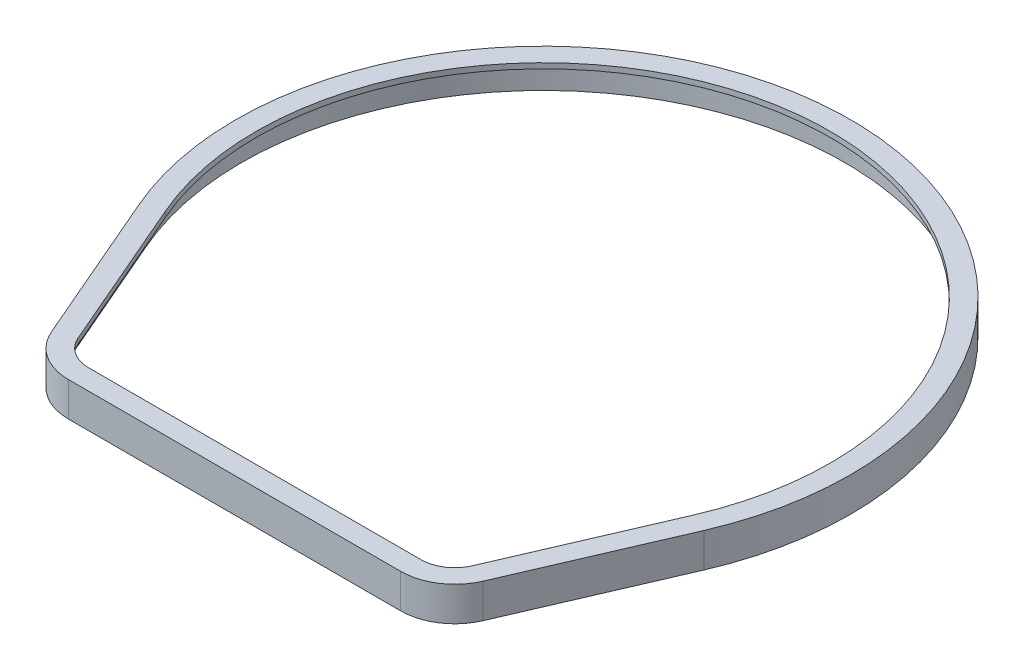
ISO-10303-21;
HEADER;
FILE_DESCRIPTION(('STEP AP214'),'2;1');
FILE_NAME('part.step','',(''),(''),'','','');
FILE_SCHEMA(('AUTOMOTIVE_DESIGN { 1 0 10303 214 1 1 1 1 }'));
ENDSEC;
DATA;
#1=APPLICATION_CONTEXT('core data for automotive mechanical design processes');
#2=APPLICATION_PROTOCOL_DEFINITION('international standard','automotive_design',2000,#1);
#3=PRODUCT_CONTEXT('',#1,'mechanical');
#4=PRODUCT('Part','Part','',(#3));
#5=PRODUCT_RELATED_PRODUCT_CATEGORY('part','',(#4));
#6=PRODUCT_DEFINITION_FORMATION('','',#4);
#7=PRODUCT_DEFINITION_CONTEXT('part definition',#1,'design');
#8=PRODUCT_DEFINITION('design','',#6,#7);
#9=PRODUCT_DEFINITION_SHAPE('','',#8);
#10=(LENGTH_UNIT() NAMED_UNIT(*) SI_UNIT(.MILLI.,.METRE.));
#11=(NAMED_UNIT(*) PLANE_ANGLE_UNIT() SI_UNIT($,.RADIAN.));
#12=(NAMED_UNIT(*) SI_UNIT($,.STERADIAN.) SOLID_ANGLE_UNIT());
#13=UNCERTAINTY_MEASURE_WITH_UNIT(LENGTH_MEASURE(1.E-05),#10,'distance_accuracy_value','');
#14=(GEOMETRIC_REPRESENTATION_CONTEXT(3) GLOBAL_UNCERTAINTY_ASSIGNED_CONTEXT((#13)) GLOBAL_UNIT_ASSIGNED_CONTEXT((#10,
#11,#12)) REPRESENTATION_CONTEXT('',''));
#15=CARTESIAN_POINT('',(0.,0.,0.));
#16=DIRECTION('',(0.,0.,1.));
#17=DIRECTION('',(1.,0.,0.));
#18=AXIS2_PLACEMENT_3D('',#15,#16,#17);
#19=CARTESIAN_POINT('',(58.4908938392196,6.,25.2290574118247));
#20=DIRECTION('',(-0.91822439308037,0.,-0.396060555915615));
#21=DIRECTION('',(-0.396060555915615,0.,0.91822439308037));
#22=AXIS2_PLACEMENT_3D('',#19,#20,#21);
#23=PLANE('',#22);
#24=DIRECTION('',(0.396060555915615,0.,-0.91822439308037));
#25=VECTOR('',#24,1.);
#26=CARTESIAN_POINT('',(58.4908938392196,0.,25.2290574118247));
#27=LINE('',#26,#25);
#28=CARTESIAN_POINT('',(44.7068598792863,0.,57.1858782262549));
#29=VERTEX_POINT('',#28);
#30=CARTESIAN_POINT('',(58.4908938392195,0.,25.2290574118249));
#31=VERTEX_POINT('',#30);
#32=EDGE_CURVE('E121',#29,#31,#27,.T.);
#33=ORIENTED_EDGE('',*,*,#32,.T.);
#34=DIRECTION('',(0.,-1.,0.));
#35=VECTOR('',#34,1.);
#36=CARTESIAN_POINT('',(58.4908938392195,6.,25.2290574118249));
#37=LINE('',#36,#35);
#38=CARTESIAN_POINT('',(58.4908938392195,7.1,25.2290574118249));
#39=VERTEX_POINT('',#38);
#40=EDGE_CURVE('E11',#39,#31,#37,.T.);
#41=ORIENTED_EDGE('',*,*,#40,.F.);
#42=DIRECTION('',(0.396060555915615,0.,-0.91822439308037));
#43=VECTOR('',#42,1.);
#44=CARTESIAN_POINT('',(44.7068598792863,7.1,57.1858782262549));
#45=LINE('',#44,#43);
#46=CARTESIAN_POINT('',(44.7068598792863,7.1,57.1858782262549));
#47=VERTEX_POINT('',#46);
#48=EDGE_CURVE('E211',#47,#39,#45,.T.);
#49=ORIENTED_EDGE('',*,*,#48,.F.);
#50=DIRECTION('',(0.,-1.,0.));
#51=VECTOR('',#50,1.);
#52=CARTESIAN_POINT('',(44.7068598792863,6.,57.1858782262549));
#53=LINE('',#52,#51);
#54=EDGE_CURVE('E116',#47,#29,#53,.T.);
#55=ORIENTED_EDGE('',*,*,#54,.T.);
#56=EDGE_LOOP('',(#33,#41,#49,#55));
#57=FACE_BOUND('',#56,.T.);
#58=ADVANCED_FACE('F34',(#57),#23,.F.);
#59=CARTESIAN_POINT('',(0.,6.,0.));
#60=DIRECTION('',(0.,-1.,0.));
#61=DIRECTION('',(0.,0.,-1.));
#62=AXIS2_PLACEMENT_3D('',#59,#60,#61);
#63=CYLINDRICAL_SURFACE('',#62,63.7);
#64=CARTESIAN_POINT('',(0.,0.,0.));
#65=DIRECTION('',(0.,1.,0.));
#66=DIRECTION('',(0.,0.,1.));
#67=AXIS2_PLACEMENT_3D('',#64,#65,#66);
#68=CIRCLE('',#67,63.7);
#69=CARTESIAN_POINT('',(-58.4908938392195,0.,25.2290574118249));
#70=VERTEX_POINT('',#69);
#71=EDGE_CURVE('E184',#31,#70,#68,.T.);
#72=ORIENTED_EDGE('',*,*,#71,.T.);
#73=DIRECTION('',(0.,-1.,0.));
#74=VECTOR('',#73,1.);
#75=CARTESIAN_POINT('',(-58.4908938392195,6.,25.2290574118249));
#76=LINE('',#75,#74);
#77=CARTESIAN_POINT('',(-58.4908938392195,7.1,25.2290574118249));
#78=VERTEX_POINT('',#77);
#79=EDGE_CURVE('E44',#78,#70,#76,.T.);
#80=ORIENTED_EDGE('',*,*,#79,.F.);
#81=CARTESIAN_POINT('',(0.,7.1,0.));
#82=DIRECTION('',(0.,1.,0.));
#83=DIRECTION('',(0.,0.,1.));
#84=AXIS2_PLACEMENT_3D('',#81,#82,#83);
#85=CIRCLE('',#84,63.7);
#86=EDGE_CURVE('E170',#39,#78,#85,.T.);
#87=ORIENTED_EDGE('',*,*,#86,.F.);
#88=ORIENTED_EDGE('',*,*,#40,.T.);
#89=EDGE_LOOP('',(#72,#80,#87,#88));
#90=FACE_BOUND('',#89,.T.);
#91=ADVANCED_FACE('F204',(#90),#63,.T.);
#92=CARTESIAN_POINT('',(-58.4908938392196,6.,25.2290574118247));
#93=DIRECTION('',(-0.91822439308037,0.,0.396060555915615));
#94=DIRECTION('',(0.396060555915615,0.,0.91822439308037));
#95=AXIS2_PLACEMENT_3D('',#92,#93,#94);
#96=PLANE('',#95);
#97=DIRECTION('',(-0.396060555915615,0.,-0.91822439308037));
#98=VECTOR('',#97,1.);
#99=CARTESIAN_POINT('',(-58.4908938392196,0.,25.2290574118247));
#100=LINE('',#99,#98);
#101=CARTESIAN_POINT('',(-44.7068598792863,0.,57.1858782262549));
#102=VERTEX_POINT('',#101);
#103=EDGE_CURVE('E187',#102,#70,#100,.T.);
#104=ORIENTED_EDGE('',*,*,#103,.F.);
#105=DIRECTION('',(0.,-1.,0.));
#106=VECTOR('',#105,1.);
#107=CARTESIAN_POINT('',(-44.7068598792863,6.,57.1858782262549));
#108=LINE('',#107,#106);
#109=CARTESIAN_POINT('',(-44.7068598792863,7.1,57.1858782262549));
#110=VERTEX_POINT('',#109);
#111=EDGE_CURVE('E131',#110,#102,#108,.T.);
#112=ORIENTED_EDGE('',*,*,#111,.F.);
#113=DIRECTION('',(0.396060555915615,0.,0.91822439308037));
#114=VECTOR('',#113,1.);
#115=CARTESIAN_POINT('',(-58.4908938392195,7.1,25.2290574118249));
#116=LINE('',#115,#114);
#117=EDGE_CURVE('E167',#78,#110,#116,.T.);
#118=ORIENTED_EDGE('',*,*,#117,.F.);
#119=ORIENTED_EDGE('',*,*,#79,.T.);
#120=EDGE_LOOP('',(#104,#112,#118,#119));
#121=FACE_BOUND('',#120,.T.);
#122=ADVANCED_FACE('F196',(#121),#96,.T.);
#123=CARTESIAN_POINT('',(-34.4227466767862,6.,52.75));
#124=DIRECTION('',(0.,-1.,0.));
#125=DIRECTION('',(0.,0.,-1.));
#126=AXIS2_PLACEMENT_3D('',#123,#124,#125);
#127=CYLINDRICAL_SURFACE('',#126,11.2);
#128=CARTESIAN_POINT('',(-34.4227466767862,0.,52.75));
#129=DIRECTION('',(0.,1.,0.));
#130=DIRECTION('',(0.,0.,1.));
#131=AXIS2_PLACEMENT_3D('',#128,#129,#130);
#132=CIRCLE('',#131,11.2);
#133=CARTESIAN_POINT('',(-34.4227466767862,0.,63.95));
#134=VERTEX_POINT('',#133);
#135=EDGE_CURVE('E107',#102,#134,#132,.T.);
#136=ORIENTED_EDGE('',*,*,#135,.T.);
#137=DIRECTION('',(0.,-1.,0.));
#138=VECTOR('',#137,1.);
#139=CARTESIAN_POINT('',(-34.4227466767862,6.,63.95));
#140=LINE('',#139,#138);
#141=CARTESIAN_POINT('',(-34.4227466767862,7.1,63.95));
#142=VERTEX_POINT('',#141);
#143=EDGE_CURVE('E102',#142,#134,#140,.T.);
#144=ORIENTED_EDGE('',*,*,#143,.F.);
#145=CARTESIAN_POINT('',(-34.4227466767862,7.1,52.75));
#146=DIRECTION('',(0.,1.,0.));
#147=DIRECTION('',(0.,0.,1.));
#148=AXIS2_PLACEMENT_3D('',#145,#146,#147);
#149=CIRCLE('',#148,11.2);
#150=EDGE_CURVE('E220',#110,#142,#149,.T.);
#151=ORIENTED_EDGE('',*,*,#150,.F.);
#152=ORIENTED_EDGE('',*,*,#111,.T.);
#153=EDGE_LOOP('',(#136,#144,#151,#152));
#154=FACE_BOUND('',#153,.T.);
#155=ADVANCED_FACE('F190',(#154),#127,.T.);
#156=CARTESIAN_POINT('',(0.,6.,63.95));
#157=DIRECTION('',(0.,0.,-1.));
#158=DIRECTION('',(-1.,0.,0.));
#159=AXIS2_PLACEMENT_3D('',#156,#157,#158);
#160=PLANE('',#159);
#161=DIRECTION('',(1.,0.,0.));
#162=VECTOR('',#161,1.);
#163=CARTESIAN_POINT('',(0.,0.,63.95));
#164=LINE('',#163,#162);
#165=CARTESIAN_POINT('',(34.4227466767862,0.,63.95));
#166=VERTEX_POINT('',#165);
#167=EDGE_CURVE('E94',#134,#166,#164,.T.);
#168=ORIENTED_EDGE('',*,*,#167,.T.);
#169=DIRECTION('',(0.,-1.,0.));
#170=VECTOR('',#169,1.);
#171=CARTESIAN_POINT('',(34.4227466767862,6.,63.95));
#172=LINE('',#171,#170);
#173=CARTESIAN_POINT('',(34.4227466767862,7.1,63.95));
#174=VERTEX_POINT('',#173);
#175=EDGE_CURVE('E99',#174,#166,#172,.T.);
#176=ORIENTED_EDGE('',*,*,#175,.F.);
#177=DIRECTION('',(1.,0.,0.));
#178=VECTOR('',#177,1.);
#179=CARTESIAN_POINT('',(-34.4227466767862,7.1,63.95));
#180=LINE('',#179,#178);
#181=EDGE_CURVE('E217',#142,#174,#180,.T.);
#182=ORIENTED_EDGE('',*,*,#181,.F.);
#183=ORIENTED_EDGE('',*,*,#143,.T.);
#184=EDGE_LOOP('',(#168,#176,#182,#183));
#185=FACE_BOUND('',#184,.T.);
#186=ADVANCED_FACE('F96',(#185),#160,.F.);
#187=CARTESIAN_POINT('',(-34.4227466767862,6.,52.75));
#188=DIRECTION('',(0.,-1.,0.));
#189=DIRECTION('',(0.,0.,-1.));
#190=AXIS2_PLACEMENT_3D('',#187,#188,#189);
#191=CYLINDRICAL_SURFACE('',#190,10.);
#192=CARTESIAN_POINT('',(-34.4227466767862,0.,52.75));
#193=DIRECTION('',(0.,1.,0.));
#194=DIRECTION('',(0.,0.,1.));
#195=AXIS2_PLACEMENT_3D('',#192,#193,#194);
#196=CIRCLE('',#195,10.);
#197=CARTESIAN_POINT('',(-43.6049906075899,0.,56.7106055591561));
#198=VERTEX_POINT('',#197);
#199=CARTESIAN_POINT('',(-34.4227466767862,0.,62.75));
#200=VERTEX_POINT('',#199);
#201=EDGE_CURVE('E161',#198,#200,#196,.T.);
#202=ORIENTED_EDGE('',*,*,#201,.F.);
#203=DIRECTION('',(0.,-1.,0.));
#204=VECTOR('',#203,1.);
#205=CARTESIAN_POINT('',(-43.6049906075899,6.,56.7106055591561));
#206=LINE('',#205,#204);
#207=CARTESIAN_POINT('',(-43.6049906075899,6.,56.7106055591561));
#208=VERTEX_POINT('',#207);
#209=EDGE_CURVE('E38',#208,#198,#206,.T.);
#210=ORIENTED_EDGE('',*,*,#209,.F.);
#211=CARTESIAN_POINT('',(-34.4227466767862,6.,52.75));
#212=DIRECTION('',(0.,1.,0.));
#213=DIRECTION('',(0.,0.,1.));
#214=AXIS2_PLACEMENT_3D('',#211,#212,#213);
#215=CIRCLE('',#214,10.);
#216=CARTESIAN_POINT('',(-34.4227466767862,6.,62.75));
#217=VERTEX_POINT('',#216);
#218=EDGE_CURVE('E122',#208,#217,#215,.T.);
#219=ORIENTED_EDGE('',*,*,#218,.T.);
#220=DIRECTION('',(0.,-1.,0.));
#221=VECTOR('',#220,1.);
#222=CARTESIAN_POINT('',(-34.4227466767862,6.,62.75));
#223=LINE('',#222,#221);
#224=EDGE_CURVE('E134',#217,#200,#223,.T.);
#225=ORIENTED_EDGE('',*,*,#224,.T.);
#226=EDGE_LOOP('',(#202,#210,#219,#225));
#227=FACE_BOUND('',#226,.T.);
#228=ADVANCED_FACE('F36',(#227),#191,.F.);
#229=CARTESIAN_POINT('',(-57.3890245675231,6.,24.7537847447259));
#230=DIRECTION('',(-0.91822439308037,0.,0.396060555915615));
#231=DIRECTION('',(0.396060555915615,0.,0.91822439308037));
#232=AXIS2_PLACEMENT_3D('',#229,#230,#231);
#233=PLANE('',#232);
#234=DIRECTION('',(-0.396060555915615,0.,-0.91822439308037));
#235=VECTOR('',#234,1.);
#236=CARTESIAN_POINT('',(-57.3890245675231,0.,24.7537847447259));
#237=LINE('',#236,#235);
#238=CARTESIAN_POINT('',(-57.3890245675231,0.,24.7537847447261));
#239=VERTEX_POINT('',#238);
#240=EDGE_CURVE('E153',#198,#239,#237,.T.);
#241=ORIENTED_EDGE('',*,*,#240,.T.);
#242=DIRECTION('',(0.,-1.,0.));
#243=VECTOR('',#242,1.);
#244=CARTESIAN_POINT('',(-57.3890245675231,6.,24.7537847447261));
#245=LINE('',#244,#243);
#246=CARTESIAN_POINT('',(-57.3890245675231,6.,24.7537847447261));
#247=VERTEX_POINT('',#246);
#248=EDGE_CURVE('E142',#247,#239,#245,.T.);
#249=ORIENTED_EDGE('',*,*,#248,.F.);
#250=DIRECTION('',(-0.396060555915615,0.,-0.91822439308037));
#251=VECTOR('',#250,1.);
#252=CARTESIAN_POINT('',(-57.3890245675231,6.,24.7537847447259));
#253=LINE('',#252,#251);
#254=EDGE_CURVE('E125',#208,#247,#253,.T.);
#255=ORIENTED_EDGE('',*,*,#254,.F.);
#256=ORIENTED_EDGE('',*,*,#209,.T.);
#257=EDGE_LOOP('',(#241,#249,#255,#256));
#258=FACE_BOUND('',#257,.T.);
#259=ADVANCED_FACE('F152',(#258),#233,.F.);
#260=CARTESIAN_POINT('',(0.,6.,0.));
#261=DIRECTION('',(0.,-1.,0.));
#262=DIRECTION('',(0.,0.,-1.));
#263=AXIS2_PLACEMENT_3D('',#260,#261,#262);
#264=CYLINDRICAL_SURFACE('',#263,62.5);
#265=CARTESIAN_POINT('',(0.,0.,0.));
#266=DIRECTION('',(0.,1.,0.));
#267=DIRECTION('',(0.,0.,1.));
#268=AXIS2_PLACEMENT_3D('',#265,#266,#267);
#269=CIRCLE('',#268,62.5);
#270=CARTESIAN_POINT('',(57.3890245675231,0.,24.7537847447261));
#271=VERTEX_POINT('',#270);
#272=EDGE_CURVE('E164',#271,#239,#269,.T.);
#273=ORIENTED_EDGE('',*,*,#272,.F.);
#274=DIRECTION('',(0.,-1.,0.));
#275=VECTOR('',#274,1.);
#276=CARTESIAN_POINT('',(57.3890245675231,6.,24.7537847447261));
#277=LINE('',#276,#275);
#278=CARTESIAN_POINT('',(57.3890245675231,6.,24.7537847447261));
#279=VERTEX_POINT('',#278);
#280=EDGE_CURVE('E141',#279,#271,#277,.T.);
#281=ORIENTED_EDGE('',*,*,#280,.F.);
#282=CARTESIAN_POINT('',(0.,6.,0.));
#283=DIRECTION('',(0.,1.,0.));
#284=DIRECTION('',(0.,0.,1.));
#285=AXIS2_PLACEMENT_3D('',#282,#283,#284);
#286=CIRCLE('',#285,62.5);
#287=EDGE_CURVE('E226',#279,#247,#286,.T.);
#288=ORIENTED_EDGE('',*,*,#287,.T.);
#289=ORIENTED_EDGE('',*,*,#248,.T.);
#290=EDGE_LOOP('',(#273,#281,#288,#289));
#291=FACE_BOUND('',#290,.T.);
#292=ADVANCED_FACE('F251',(#291),#264,.F.);
#293=CARTESIAN_POINT('',(57.3890245675231,6.,24.7537847447259));
#294=DIRECTION('',(-0.91822439308037,0.,-0.396060555915615));
#295=DIRECTION('',(-0.396060555915615,0.,0.91822439308037));
#296=AXIS2_PLACEMENT_3D('',#293,#294,#295);
#297=PLANE('',#296);
#298=DIRECTION('',(0.396060555915615,0.,-0.91822439308037));
#299=VECTOR('',#298,1.);
#300=CARTESIAN_POINT('',(57.3890245675231,0.,24.7537847447259));
#301=LINE('',#300,#299);
#302=CARTESIAN_POINT('',(43.6049906075899,0.,56.7106055591561));
#303=VERTEX_POINT('',#302);
#304=EDGE_CURVE('E176',#303,#271,#301,.T.);
#305=ORIENTED_EDGE('',*,*,#304,.F.);
#306=DIRECTION('',(0.,-1.,0.));
#307=VECTOR('',#306,1.);
#308=CARTESIAN_POINT('',(43.6049906075899,6.,56.7106055591561));
#309=LINE('',#308,#307);
#310=CARTESIAN_POINT('',(43.6049906075899,6.,56.7106055591561));
#311=VERTEX_POINT('',#310);
#312=EDGE_CURVE('E139',#311,#303,#309,.T.);
#313=ORIENTED_EDGE('',*,*,#312,.F.);
#314=DIRECTION('',(0.396060555915615,0.,-0.91822439308037));
#315=VECTOR('',#314,1.);
#316=CARTESIAN_POINT('',(57.3890245675231,6.,24.7537847447259));
#317=LINE('',#316,#315);
#318=EDGE_CURVE('E228',#311,#279,#317,.T.);
#319=ORIENTED_EDGE('',*,*,#318,.T.);
#320=ORIENTED_EDGE('',*,*,#280,.T.);
#321=EDGE_LOOP('',(#305,#313,#319,#320));
#322=FACE_BOUND('',#321,.T.);
#323=ADVANCED_FACE('F255',(#322),#297,.T.);
#324=CARTESIAN_POINT('',(34.4227466767862,6.,52.75));
#325=DIRECTION('',(0.,-1.,0.));
#326=DIRECTION('',(0.,0.,-1.));
#327=AXIS2_PLACEMENT_3D('',#324,#325,#326);
#328=CYLINDRICAL_SURFACE('',#327,10.);
#329=CARTESIAN_POINT('',(34.4227466767862,0.,52.75));
#330=DIRECTION('',(0.,1.,0.));
#331=DIRECTION('',(0.,0.,1.));
#332=AXIS2_PLACEMENT_3D('',#329,#330,#331);
#333=CIRCLE('',#332,10.);
#334=CARTESIAN_POINT('',(34.4227466767862,0.,62.75));
#335=VERTEX_POINT('',#334);
#336=EDGE_CURVE('E178',#335,#303,#333,.T.);
#337=ORIENTED_EDGE('',*,*,#336,.F.);
#338=DIRECTION('',(0.,-1.,0.));
#339=VECTOR('',#338,1.);
#340=CARTESIAN_POINT('',(34.4227466767862,6.,62.75));
#341=LINE('',#340,#339);
#342=CARTESIAN_POINT('',(34.4227466767862,6.,62.75));
#343=VERTEX_POINT('',#342);
#344=EDGE_CURVE('E136',#343,#335,#341,.T.);
#345=ORIENTED_EDGE('',*,*,#344,.F.);
#346=CARTESIAN_POINT('',(34.4227466767862,6.,52.75));
#347=DIRECTION('',(0.,1.,0.));
#348=DIRECTION('',(0.,0.,1.));
#349=AXIS2_PLACEMENT_3D('',#346,#347,#348);
#350=CIRCLE('',#349,10.);
#351=EDGE_CURVE('E52',#343,#311,#350,.T.);
#352=ORIENTED_EDGE('',*,*,#351,.T.);
#353=ORIENTED_EDGE('',*,*,#312,.T.);
#354=EDGE_LOOP('',(#337,#345,#352,#353));
#355=FACE_BOUND('',#354,.T.);
#356=ADVANCED_FACE('F256',(#355),#328,.F.);
#357=CARTESIAN_POINT('',(0.,6.,62.75));
#358=DIRECTION('',(0.,0.,-1.));
#359=DIRECTION('',(-1.,0.,0.));
#360=AXIS2_PLACEMENT_3D('',#357,#358,#359);
#361=PLANE('',#360);
#362=DIRECTION('',(1.,0.,0.));
#363=VECTOR('',#362,1.);
#364=CARTESIAN_POINT('',(0.,0.,62.75));
#365=LINE('',#364,#363);
#366=EDGE_CURVE('E181',#200,#335,#365,.T.);
#367=ORIENTED_EDGE('',*,*,#366,.F.);
#368=ORIENTED_EDGE('',*,*,#224,.F.);
#369=DIRECTION('',(1.,0.,0.));
#370=VECTOR('',#369,1.);
#371=CARTESIAN_POINT('',(0.,6.,62.75));
#372=LINE('',#371,#370);
#373=EDGE_CURVE('E137',#217,#343,#372,.T.);
#374=ORIENTED_EDGE('',*,*,#373,.T.);
#375=ORIENTED_EDGE('',*,*,#344,.T.);
#376=EDGE_LOOP('',(#367,#368,#374,#375));
#377=FACE_BOUND('',#376,.T.);
#378=ADVANCED_FACE('F234',(#377),#361,.T.);
#379=CARTESIAN_POINT('',(34.4227466767862,6.,52.75));
#380=DIRECTION('',(0.,-1.,0.));
#381=DIRECTION('',(0.,0.,-1.));
#382=AXIS2_PLACEMENT_3D('',#379,#380,#381);
#383=CYLINDRICAL_SURFACE('',#382,11.2);
#384=CARTESIAN_POINT('',(34.4227466767862,0.,52.75));
#385=DIRECTION('',(0.,1.,0.));
#386=DIRECTION('',(0.,0.,1.));
#387=AXIS2_PLACEMENT_3D('',#384,#385,#386);
#388=CIRCLE('',#387,11.2);
#389=EDGE_CURVE('E106',#166,#29,#388,.T.);
#390=ORIENTED_EDGE('',*,*,#389,.T.);
#391=ORIENTED_EDGE('',*,*,#54,.F.);
#392=CARTESIAN_POINT('',(34.4227466767862,7.1,52.75));
#393=DIRECTION('',(0.,1.,0.));
#394=DIRECTION('',(0.,0.,1.));
#395=AXIS2_PLACEMENT_3D('',#392,#393,#394);
#396=CIRCLE('',#395,11.2);
#397=EDGE_CURVE('E115',#174,#47,#396,.T.);
#398=ORIENTED_EDGE('',*,*,#397,.F.);
#399=ORIENTED_EDGE('',*,*,#175,.T.);
#400=EDGE_LOOP('',(#390,#391,#398,#399));
#401=FACE_BOUND('',#400,.T.);
#402=ADVANCED_FACE('F111',(#401),#383,.T.);
#403=CARTESIAN_POINT('',(0.,0.,0.));
#404=DIRECTION('',(0.,1.,0.));
#405=DIRECTION('',(0.,0.,1.));
#406=AXIS2_PLACEMENT_3D('',#403,#404,#405);
#407=PLANE('',#406);
#408=ORIENTED_EDGE('',*,*,#201,.T.);
#409=ORIENTED_EDGE('',*,*,#366,.T.);
#410=ORIENTED_EDGE('',*,*,#336,.T.);
#411=ORIENTED_EDGE('',*,*,#304,.T.);
#412=ORIENTED_EDGE('',*,*,#272,.T.);
#413=ORIENTED_EDGE('',*,*,#240,.F.);
#414=EDGE_LOOP('',(#408,#409,#410,#411,#412,#413));
#415=FACE_BOUND('',#414,.T.);
#416=ORIENTED_EDGE('',*,*,#32,.F.);
#417=ORIENTED_EDGE('',*,*,#389,.F.);
#418=ORIENTED_EDGE('',*,*,#167,.F.);
#419=ORIENTED_EDGE('',*,*,#135,.F.);
#420=ORIENTED_EDGE('',*,*,#103,.T.);
#421=ORIENTED_EDGE('',*,*,#71,.F.);
#422=EDGE_LOOP('',(#416,#417,#418,#419,#420,#421));
#423=FACE_BOUND('',#422,.T.);
#424=ADVANCED_FACE('F119',(#415,#423),#407,.F.);
#425=CARTESIAN_POINT('',(-34.4227466767862,6.,52.75));
#426=DIRECTION('',(0.,1.,0.));
#427=DIRECTION('',(0.,0.,1.));
#428=AXIS2_PLACEMENT_3D('',#425,#426,#427);
#429=PLANE('',#428);
#430=CARTESIAN_POINT('',(34.4227466767862,6.,52.75));
#431=DIRECTION('',(0.,1.,0.));
#432=DIRECTION('',(0.,0.,1.));
#433=AXIS2_PLACEMENT_3D('',#430,#431,#432);
#434=CIRCLE('',#433,7.00000000000001);
#435=CARTESIAN_POINT('',(34.4227466767862,6.,59.75));
#436=VERTEX_POINT('',#435);
#437=CARTESIAN_POINT('',(40.8503174283488,6.,55.5224238914093));
#438=VERTEX_POINT('',#437);
#439=EDGE_CURVE('E403',#436,#438,#434,.T.);
#440=ORIENTED_EDGE('',*,*,#439,.T.);
#441=DIRECTION('',(0.396060555915615,0.,-0.91822439308037));
#442=VECTOR('',#441,1.);
#443=CARTESIAN_POINT('',(40.8503174283488,6.,55.5224238914093));
#444=LINE('',#443,#442);
#445=CARTESIAN_POINT('',(54.6343513882819,6.,23.5656030769793));
#446=VERTEX_POINT('',#445);
#447=EDGE_CURVE('E391',#438,#446,#444,.T.);
#448=ORIENTED_EDGE('',*,*,#447,.T.);
#449=CARTESIAN_POINT('',(0.,6.,0.));
#450=DIRECTION('',(0.,1.,0.));
#451=DIRECTION('',(0.,0.,1.));
#452=AXIS2_PLACEMENT_3D('',#449,#450,#451);
#453=CIRCLE('',#452,59.5);
#454=CARTESIAN_POINT('',(-54.6343513882819,6.,23.5656030769793));
#455=VERTEX_POINT('',#454);
#456=EDGE_CURVE('E338',#446,#455,#453,.T.);
#457=ORIENTED_EDGE('',*,*,#456,.T.);
#458=DIRECTION('',(0.396060555915615,0.,0.91822439308037));
#459=VECTOR('',#458,1.);
#460=CARTESIAN_POINT('',(-54.6343513882819,6.,23.5656030769793));
#461=LINE('',#460,#459);
#462=CARTESIAN_POINT('',(-40.8503174283488,6.,55.5224238914093));
#463=VERTEX_POINT('',#462);
#464=EDGE_CURVE('E335',#455,#463,#461,.T.);
#465=ORIENTED_EDGE('',*,*,#464,.T.);
#466=CARTESIAN_POINT('',(-34.4227466767862,6.,52.75));
#467=DIRECTION('',(0.,1.,0.));
#468=DIRECTION('',(0.,0.,1.));
#469=AXIS2_PLACEMENT_3D('',#466,#467,#468);
#470=CIRCLE('',#469,7.00000000000001);
#471=CARTESIAN_POINT('',(-34.4227466767862,6.,59.75));
#472=VERTEX_POINT('',#471);
#473=EDGE_CURVE('E329',#463,#472,#470,.T.);
#474=ORIENTED_EDGE('',*,*,#473,.T.);
#475=DIRECTION('',(1.,0.,0.));
#476=VECTOR('',#475,1.);
#477=CARTESIAN_POINT('',(-34.4227466767862,6.,59.75));
#478=LINE('',#477,#476);
#479=EDGE_CURVE('E316',#472,#436,#478,.T.);
#480=ORIENTED_EDGE('',*,*,#479,.T.);
#481=EDGE_LOOP('',(#440,#448,#457,#465,#474,#480));
#482=FACE_BOUND('',#481,.T.);
#483=ORIENTED_EDGE('',*,*,#218,.F.);
#484=ORIENTED_EDGE('',*,*,#254,.T.);
#485=ORIENTED_EDGE('',*,*,#287,.F.);
#486=ORIENTED_EDGE('',*,*,#318,.F.);
#487=ORIENTED_EDGE('',*,*,#351,.F.);
#488=ORIENTED_EDGE('',*,*,#373,.F.);
#489=EDGE_LOOP('',(#483,#484,#485,#486,#487,#488));
#490=FACE_BOUND('',#489,.T.);
#491=ADVANCED_FACE('F238',(#482,#490),#429,.F.);
#492=CARTESIAN_POINT('',(-34.4227466767862,7.1,52.75));
#493=DIRECTION('',(0.,1.,0.));
#494=DIRECTION('',(0.,0.,1.));
#495=AXIS2_PLACEMENT_3D('',#492,#493,#494);
#496=PLANE('',#495);
#497=ORIENTED_EDGE('',*,*,#150,.T.);
#498=ORIENTED_EDGE('',*,*,#181,.T.);
#499=ORIENTED_EDGE('',*,*,#397,.T.);
#500=ORIENTED_EDGE('',*,*,#48,.T.);
#501=ORIENTED_EDGE('',*,*,#86,.T.);
#502=ORIENTED_EDGE('',*,*,#117,.T.);
#503=EDGE_LOOP('',(#497,#498,#499,#500,#501,#502));
#504=FACE_BOUND('',#503,.T.);
#505=DIRECTION('',(0.396060555915615,0.,-0.91822439308037));
#506=VECTOR('',#505,1.);
#507=CARTESIAN_POINT('',(40.8503174283488,7.1,55.5224238914093));
#508=LINE('',#507,#506);
#509=CARTESIAN_POINT('',(40.8503174283488,7.1,55.5224238914093));
#510=VERTEX_POINT('',#509);
#511=CARTESIAN_POINT('',(54.6343513882819,7.1,23.5656030769793));
#512=VERTEX_POINT('',#511);
#513=EDGE_CURVE('E387',#510,#512,#508,.T.);
#514=ORIENTED_EDGE('',*,*,#513,.F.);
#515=CARTESIAN_POINT('',(34.4227466767862,7.1,52.75));
#516=DIRECTION('',(0.,1.,0.));
#517=DIRECTION('',(0.,0.,1.));
#518=AXIS2_PLACEMENT_3D('',#515,#516,#517);
#519=CIRCLE('',#518,7.00000000000001);
#520=CARTESIAN_POINT('',(34.4227466767862,7.1,59.75));
#521=VERTEX_POINT('',#520);
#522=EDGE_CURVE('E328',#521,#510,#519,.T.);
#523=ORIENTED_EDGE('',*,*,#522,.F.);
#524=DIRECTION('',(1.,0.,0.));
#525=VECTOR('',#524,1.);
#526=CARTESIAN_POINT('',(-34.4227466767862,7.1,59.75));
#527=LINE('',#526,#525);
#528=CARTESIAN_POINT('',(-34.4227466767862,7.1,59.75));
#529=VERTEX_POINT('',#528);
#530=EDGE_CURVE('E343',#529,#521,#527,.T.);
#531=ORIENTED_EDGE('',*,*,#530,.F.);
#532=CARTESIAN_POINT('',(-34.4227466767862,7.1,52.75));
#533=DIRECTION('',(0.,1.,0.));
#534=DIRECTION('',(0.,0.,1.));
#535=AXIS2_PLACEMENT_3D('',#532,#533,#534);
#536=CIRCLE('',#535,7.00000000000001);
#537=CARTESIAN_POINT('',(-40.8503174283488,7.1,55.5224238914093));
#538=VERTEX_POINT('',#537);
#539=EDGE_CURVE('E400',#538,#529,#536,.T.);
#540=ORIENTED_EDGE('',*,*,#539,.F.);
#541=DIRECTION('',(0.396060555915615,0.,0.91822439308037));
#542=VECTOR('',#541,1.);
#543=CARTESIAN_POINT('',(-54.6343513882819,7.1,23.5656030769793));
#544=LINE('',#543,#542);
#545=CARTESIAN_POINT('',(-54.6343513882819,7.1,23.5656030769793));
#546=VERTEX_POINT('',#545);
#547=EDGE_CURVE('E396',#546,#538,#544,.T.);
#548=ORIENTED_EDGE('',*,*,#547,.F.);
#549=CARTESIAN_POINT('',(0.,7.1,0.));
#550=DIRECTION('',(0.,1.,0.));
#551=DIRECTION('',(0.,0.,1.));
#552=AXIS2_PLACEMENT_3D('',#549,#550,#551);
#553=CIRCLE('',#552,59.5);
#554=EDGE_CURVE('E394',#512,#546,#553,.T.);
#555=ORIENTED_EDGE('',*,*,#554,.F.);
#556=EDGE_LOOP('',(#514,#523,#531,#540,#548,#555));
#557=FACE_BOUND('',#556,.T.);
#558=ADVANCED_FACE('F215',(#504,#557),#496,.T.);
#559=CARTESIAN_POINT('',(34.4227466767862,7.1,52.75));
#560=DIRECTION('',(0.,-1.,0.));
#561=DIRECTION('',(0.,0.,-1.));
#562=AXIS2_PLACEMENT_3D('',#559,#560,#561);
#563=CYLINDRICAL_SURFACE('',#562,7.00000000000001);
#564=ORIENTED_EDGE('',*,*,#439,.F.);
#565=DIRECTION('',(0.,-1.,0.));
#566=VECTOR('',#565,1.);
#567=CARTESIAN_POINT('',(34.4227466767862,7.1,59.75));
#568=LINE('',#567,#566);
#569=EDGE_CURVE('E323',#521,#436,#568,.T.);
#570=ORIENTED_EDGE('',*,*,#569,.F.);
#571=ORIENTED_EDGE('',*,*,#522,.T.);
#572=DIRECTION('',(0.,-1.,0.));
#573=VECTOR('',#572,1.);
#574=CARTESIAN_POINT('',(40.8503174283488,7.1,55.5224238914093));
#575=LINE('',#574,#573);
#576=EDGE_CURVE('E354',#510,#438,#575,.T.);
#577=ORIENTED_EDGE('',*,*,#576,.T.);
#578=EDGE_LOOP('',(#564,#570,#571,#577));
#579=FACE_BOUND('',#578,.T.);
#580=ADVANCED_FACE('F287',(#579),#563,.F.);
#581=CARTESIAN_POINT('',(40.8503174283488,7.1,55.5224238914093));
#582=DIRECTION('',(-0.91822439308037,0.,-0.396060555915615));
#583=DIRECTION('',(-0.396060555915615,0.,0.91822439308037));
#584=AXIS2_PLACEMENT_3D('',#581,#582,#583);
#585=PLANE('',#584);
#586=ORIENTED_EDGE('',*,*,#447,.F.);
#587=ORIENTED_EDGE('',*,*,#576,.F.);
#588=ORIENTED_EDGE('',*,*,#513,.T.);
#589=DIRECTION('',(0.,-1.,0.));
#590=VECTOR('',#589,1.);
#591=CARTESIAN_POINT('',(54.6343513882819,7.1,23.5656030769793));
#592=LINE('',#591,#590);
#593=EDGE_CURVE('E351',#512,#446,#592,.T.);
#594=ORIENTED_EDGE('',*,*,#593,.T.);
#595=EDGE_LOOP('',(#586,#587,#588,#594));
#596=FACE_BOUND('',#595,.T.);
#597=ADVANCED_FACE('F290',(#596),#585,.T.);
#598=CARTESIAN_POINT('',(0.,7.1,0.));
#599=DIRECTION('',(0.,-1.,0.));
#600=DIRECTION('',(0.,0.,-1.));
#601=AXIS2_PLACEMENT_3D('',#598,#599,#600);
#602=CYLINDRICAL_SURFACE('',#601,59.5);
#603=ORIENTED_EDGE('',*,*,#456,.F.);
#604=ORIENTED_EDGE('',*,*,#593,.F.);
#605=ORIENTED_EDGE('',*,*,#554,.T.);
#606=DIRECTION('',(0.,-1.,0.));
#607=VECTOR('',#606,1.);
#608=CARTESIAN_POINT('',(-54.6343513882819,7.1,23.5656030769793));
#609=LINE('',#608,#607);
#610=EDGE_CURVE('E348',#546,#455,#609,.T.);
#611=ORIENTED_EDGE('',*,*,#610,.T.);
#612=EDGE_LOOP('',(#603,#604,#605,#611));
#613=FACE_BOUND('',#612,.T.);
#614=ADVANCED_FACE('F294',(#613),#602,.F.);
#615=CARTESIAN_POINT('',(-54.6343513882819,7.1,23.5656030769793));
#616=DIRECTION('',(0.91822439308037,0.,-0.396060555915615));
#617=DIRECTION('',(-0.396060555915615,0.,-0.91822439308037));
#618=AXIS2_PLACEMENT_3D('',#615,#616,#617);
#619=PLANE('',#618);
#620=ORIENTED_EDGE('',*,*,#464,.F.);
#621=ORIENTED_EDGE('',*,*,#610,.F.);
#622=ORIENTED_EDGE('',*,*,#547,.T.);
#623=DIRECTION('',(0.,-1.,0.));
#624=VECTOR('',#623,1.);
#625=CARTESIAN_POINT('',(-40.8503174283488,7.1,55.5224238914093));
#626=LINE('',#625,#624);
#627=EDGE_CURVE('E345',#538,#463,#626,.T.);
#628=ORIENTED_EDGE('',*,*,#627,.T.);
#629=EDGE_LOOP('',(#620,#621,#622,#628));
#630=FACE_BOUND('',#629,.T.);
#631=ADVANCED_FACE('F298',(#630),#619,.T.);
#632=CARTESIAN_POINT('',(-34.4227466767862,7.1,52.75));
#633=DIRECTION('',(0.,-1.,0.));
#634=DIRECTION('',(0.,0.,-1.));
#635=AXIS2_PLACEMENT_3D('',#632,#633,#634);
#636=CYLINDRICAL_SURFACE('',#635,7.00000000000001);
#637=ORIENTED_EDGE('',*,*,#473,.F.);
#638=ORIENTED_EDGE('',*,*,#627,.F.);
#639=ORIENTED_EDGE('',*,*,#539,.T.);
#640=DIRECTION('',(0.,-1.,0.));
#641=VECTOR('',#640,1.);
#642=CARTESIAN_POINT('',(-34.4227466767862,7.1,59.75));
#643=LINE('',#642,#641);
#644=EDGE_CURVE('E320',#529,#472,#643,.T.);
#645=ORIENTED_EDGE('',*,*,#644,.T.);
#646=EDGE_LOOP('',(#637,#638,#639,#645));
#647=FACE_BOUND('',#646,.T.);
#648=ADVANCED_FACE('F302',(#647),#636,.F.);
#649=CARTESIAN_POINT('',(-34.4227466767862,7.1,59.75));
#650=DIRECTION('',(0.,0.,-1.));
#651=DIRECTION('',(-1.,0.,0.));
#652=AXIS2_PLACEMENT_3D('',#649,#650,#651);
#653=PLANE('',#652);
#654=ORIENTED_EDGE('',*,*,#479,.F.);
#655=ORIENTED_EDGE('',*,*,#644,.F.);
#656=ORIENTED_EDGE('',*,*,#530,.T.);
#657=ORIENTED_EDGE('',*,*,#569,.T.);
#658=EDGE_LOOP('',(#654,#655,#656,#657));
#659=FACE_BOUND('',#658,.T.);
#660=ADVANCED_FACE('F306',(#659),#653,.T.);
#661=CLOSED_SHELL('',(#58,#91,#122,#155,#186,#228,#259,#292,#323,#356,#378,#402,#424,#491,#558,
#580,#597,#614,#631,#648,#660));
#662=MANIFOLD_SOLID_BREP('B2',#661);
#663=ADVANCED_BREP_SHAPE_REPRESENTATION('',(#18,#662),#14);
#664=SHAPE_DEFINITION_REPRESENTATION(#9,#663);
ENDSEC;
END-ISO-10303-21;
